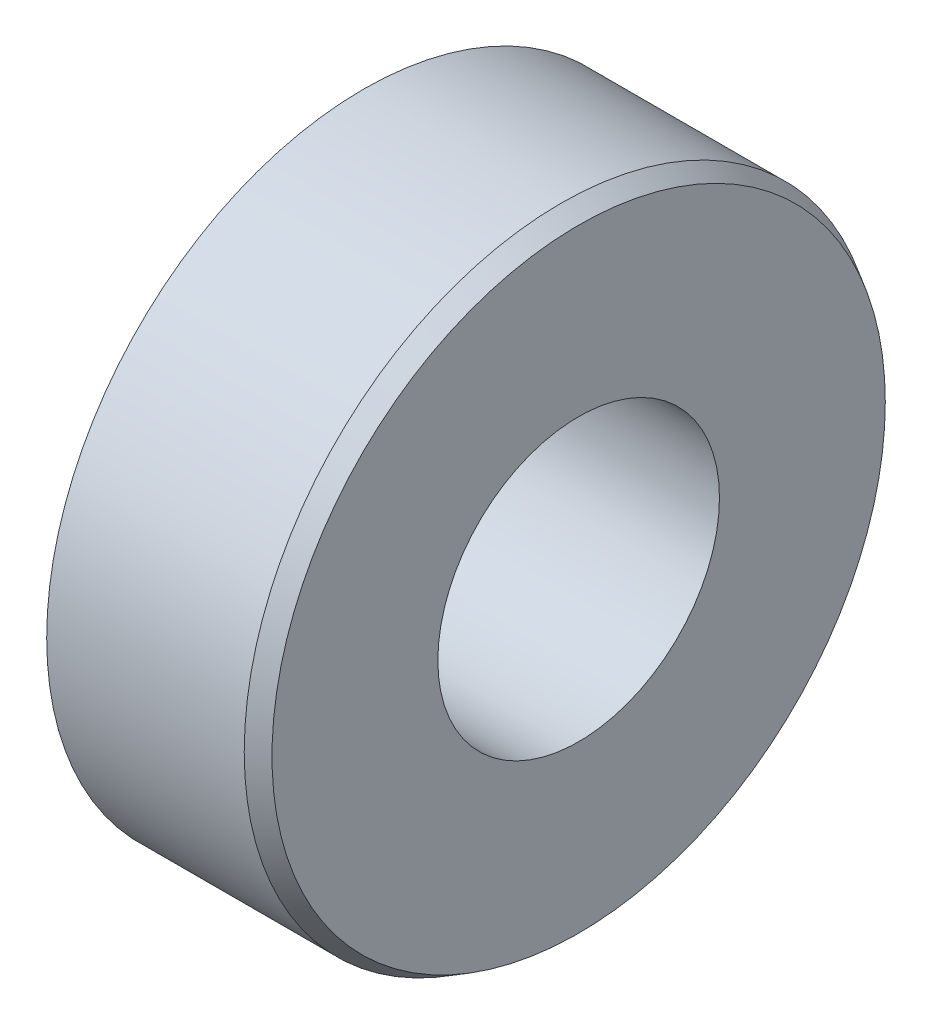
ISO-10303-21;
HEADER;
FILE_DESCRIPTION(('STEP AP214'),'2;1');
FILE_NAME('part.step','',(''),(''),'','','');
FILE_SCHEMA(('AUTOMOTIVE_DESIGN { 1 0 10303 214 1 1 1 1 }'));
ENDSEC;
DATA;
#1=APPLICATION_CONTEXT('core data for automotive mechanical design processes');
#2=APPLICATION_PROTOCOL_DEFINITION('international standard','automotive_design',2000,#1);
#3=PRODUCT_CONTEXT('',#1,'mechanical');
#4=PRODUCT('Part','Part','',(#3));
#5=PRODUCT_RELATED_PRODUCT_CATEGORY('part','',(#4));
#6=PRODUCT_DEFINITION_FORMATION('','',#4);
#7=PRODUCT_DEFINITION_CONTEXT('part definition',#1,'design');
#8=PRODUCT_DEFINITION('design','',#6,#7);
#9=PRODUCT_DEFINITION_SHAPE('','',#8);
#10=(LENGTH_UNIT() NAMED_UNIT(*) SI_UNIT(.MILLI.,.METRE.));
#11=(NAMED_UNIT(*) PLANE_ANGLE_UNIT() SI_UNIT($,.RADIAN.));
#12=(NAMED_UNIT(*) SI_UNIT($,.STERADIAN.) SOLID_ANGLE_UNIT());
#13=UNCERTAINTY_MEASURE_WITH_UNIT(LENGTH_MEASURE(1.E-05),#10,'distance_accuracy_value','');
#14=(GEOMETRIC_REPRESENTATION_CONTEXT(3) GLOBAL_UNCERTAINTY_ASSIGNED_CONTEXT((#13)) GLOBAL_UNIT_ASSIGNED_CONTEXT((#10,
#11,#12)) REPRESENTATION_CONTEXT('',''));
#15=CARTESIAN_POINT('',(0.,0.,0.));
#16=DIRECTION('',(0.,0.,1.));
#17=DIRECTION('',(1.,0.,0.));
#18=AXIS2_PLACEMENT_3D('',#15,#16,#17);
#19=CARTESIAN_POINT('',(32.,0.,0.));
#20=DIRECTION('',(1.,0.,0.));
#21=DIRECTION('',(0.,0.,-1.));
#22=AXIS2_PLACEMENT_3D('',#19,#20,#21);
#23=PLANE('',#22);
#24=CARTESIAN_POINT('',(32.,0.,0.));
#25=DIRECTION('',(1.,0.,0.));
#26=DIRECTION('',(0.,0.,-1.));
#27=AXIS2_PLACEMENT_3D('',#24,#25,#26);
#28=CIRCLE('',#27,43.5566243270259);
#29=CARTESIAN_POINT('',(32.,0.,-43.5566243270259));
#30=VERTEX_POINT('',#29);
#31=EDGE_CURVE('E10',#30,#30,#28,.T.);
#32=ORIENTED_EDGE('',*,*,#31,.T.);
#33=EDGE_LOOP('',(#32));
#34=FACE_BOUND('',#33,.T.);
#35=CARTESIAN_POINT('',(32.,0.,0.));
#36=DIRECTION('',(1.,0.,0.));
#37=DIRECTION('',(0.,0.,-1.));
#38=AXIS2_PLACEMENT_3D('',#35,#36,#37);
#39=CIRCLE('',#38,20.);
#40=CARTESIAN_POINT('',(32.,0.,-20.));
#41=VERTEX_POINT('',#40);
#42=EDGE_CURVE('E63',#41,#41,#39,.T.);
#43=ORIENTED_EDGE('',*,*,#42,.F.);
#44=EDGE_LOOP('',(#43));
#45=FACE_BOUND('',#44,.T.);
#46=ADVANCED_FACE('F42',(#34,#45),#23,.T.);
#47=CARTESIAN_POINT('',(0.,0.,0.));
#48=DIRECTION('',(1.,0.,0.));
#49=DIRECTION('',(0.,0.,-1.));
#50=AXIS2_PLACEMENT_3D('',#47,#48,#49);
#51=PLANE('',#50);
#52=CARTESIAN_POINT('',(0.,0.,0.));
#53=DIRECTION('',(1.,0.,0.));
#54=DIRECTION('',(0.,0.,-1.));
#55=AXIS2_PLACEMENT_3D('',#52,#53,#54);
#56=CIRCLE('',#55,42.5);
#57=CARTESIAN_POINT('',(0.,0.,-42.5));
#58=VERTEX_POINT('',#57);
#59=EDGE_CURVE('E50',#58,#58,#56,.F.);
#60=ORIENTED_EDGE('',*,*,#59,.T.);
#61=EDGE_LOOP('',(#60));
#62=FACE_BOUND('',#61,.T.);
#63=CARTESIAN_POINT('',(0.,0.,0.));
#64=DIRECTION('',(1.,0.,0.));
#65=DIRECTION('',(0.,0.,-1.));
#66=AXIS2_PLACEMENT_3D('',#63,#64,#65);
#67=CIRCLE('',#66,20.);
#68=CARTESIAN_POINT('',(0.,0.,-20.));
#69=VERTEX_POINT('',#68);
#70=EDGE_CURVE('E64',#69,#69,#67,.T.);
#71=ORIENTED_EDGE('',*,*,#70,.T.);
#72=EDGE_LOOP('',(#71));
#73=FACE_BOUND('',#72,.T.);
#74=ADVANCED_FACE('F74',(#62,#73),#51,.F.);
#75=CARTESIAN_POINT('',(32.,0.,0.));
#76=DIRECTION('',(-1.,0.,0.));
#77=DIRECTION('',(0.,0.,1.));
#78=AXIS2_PLACEMENT_3D('',#75,#76,#77);
#79=CYLINDRICAL_SURFACE('',#78,45.);
#80=CARTESIAN_POINT('',(1.44337567297408,0.,0.));
#81=DIRECTION('',(1.,0.,0.));
#82=DIRECTION('',(0.,0.,-1.));
#83=AXIS2_PLACEMENT_3D('',#80,#81,#82);
#84=CIRCLE('',#83,45.);
#85=CARTESIAN_POINT('',(1.44337567297408,0.,-45.));
#86=VERTEX_POINT('',#85);
#87=EDGE_CURVE('E54',#86,#86,#84,.T.);
#88=ORIENTED_EDGE('',*,*,#87,.T.);
#89=EDGE_LOOP('',(#88));
#90=FACE_BOUND('',#89,.T.);
#91=CARTESIAN_POINT('',(29.5,0.,0.));
#92=DIRECTION('',(1.,0.,0.));
#93=DIRECTION('',(0.,0.,-1.));
#94=AXIS2_PLACEMENT_3D('',#91,#92,#93);
#95=CIRCLE('',#94,45.);
#96=CARTESIAN_POINT('',(29.5,0.,-45.));
#97=VERTEX_POINT('',#96);
#98=EDGE_CURVE('E58',#97,#97,#95,.F.);
#99=ORIENTED_EDGE('',*,*,#98,.T.);
#100=EDGE_LOOP('',(#99));
#101=FACE_BOUND('',#100,.T.);
#102=ADVANCED_FACE('F80',(#90,#101),#79,.T.);
#103=CARTESIAN_POINT('',(32.,0.,0.));
#104=DIRECTION('',(-1.,0.,0.));
#105=DIRECTION('',(0.,0.,1.));
#106=AXIS2_PLACEMENT_3D('',#103,#104,#105);
#107=CYLINDRICAL_SURFACE('',#106,20.);
#108=ORIENTED_EDGE('',*,*,#42,.T.);
#109=EDGE_LOOP('',(#108));
#110=FACE_BOUND('',#109,.T.);
#111=ORIENTED_EDGE('',*,*,#70,.F.);
#112=EDGE_LOOP('',(#111));
#113=FACE_BOUND('',#112,.T.);
#114=ADVANCED_FACE('F70',(#110,#113),#107,.F.);
#115=CARTESIAN_POINT('',(1.44337567297408,0.,0.));
#116=DIRECTION('',(1.,0.,0.));
#117=DIRECTION('',(0.,0.,-1.));
#118=AXIS2_PLACEMENT_3D('',#115,#116,#117);
#119=CONICAL_SURFACE('',#118,45.,1.0471975511966);
#120=ORIENTED_EDGE('',*,*,#59,.F.);
#121=EDGE_LOOP('',(#120));
#122=FACE_BOUND('',#121,.T.);
#123=ORIENTED_EDGE('',*,*,#87,.F.);
#124=EDGE_LOOP('',(#123));
#125=FACE_BOUND('',#124,.T.);
#126=ADVANCED_FACE('F87',(#122,#125),#119,.T.);
#127=CARTESIAN_POINT('',(32.,0.,0.));
#128=DIRECTION('',(-1.,0.,0.));
#129=DIRECTION('',(0.,0.,1.));
#130=AXIS2_PLACEMENT_3D('',#127,#128,#129);
#131=CONICAL_SURFACE('',#130,43.5566243270259,0.523598775598299);
#132=ORIENTED_EDGE('',*,*,#98,.F.);
#133=EDGE_LOOP('',(#132));
#134=FACE_BOUND('',#133,.T.);
#135=ORIENTED_EDGE('',*,*,#31,.F.);
#136=EDGE_LOOP('',(#135));
#137=FACE_BOUND('',#136,.T.);
#138=ADVANCED_FACE('F45',(#134,#137),#131,.T.);
#139=CLOSED_SHELL('',(#46,#74,#102,#114,#126,#138));
#140=MANIFOLD_SOLID_BREP('B2',#139);
#141=ADVANCED_BREP_SHAPE_REPRESENTATION('',(#18,#140),#14);
#142=SHAPE_DEFINITION_REPRESENTATION(#9,#141);
ENDSEC;
END-ISO-10303-21;
